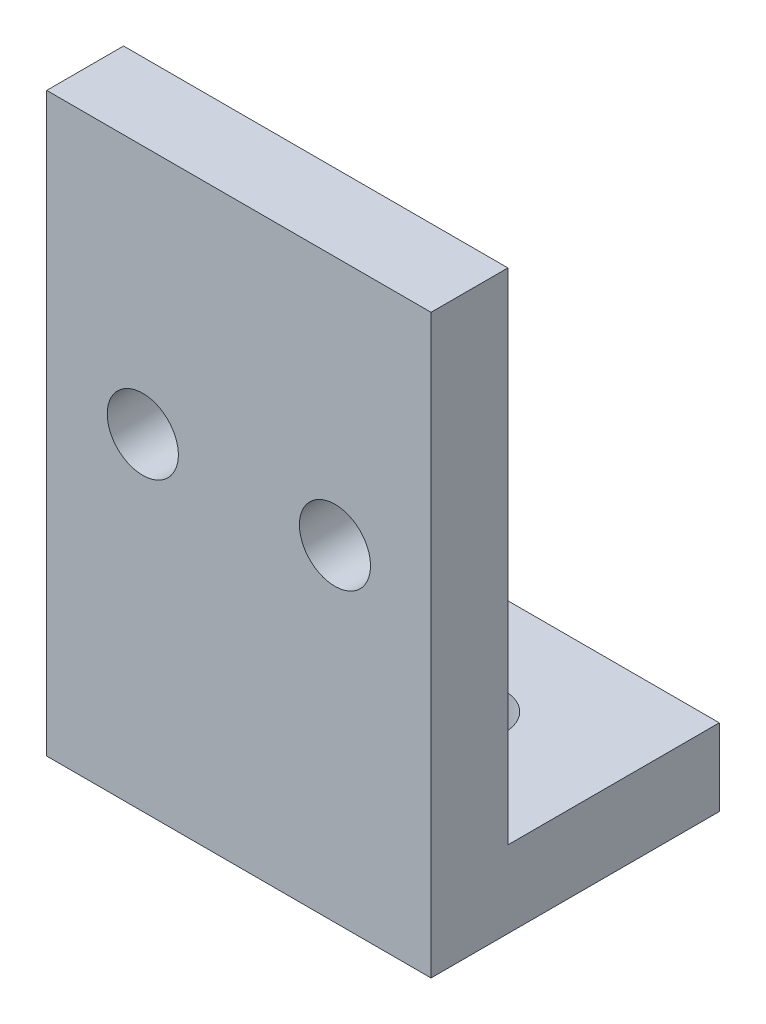
ISO-10303-21;
HEADER;
FILE_DESCRIPTION(('STEP AP214'),'2;1');
FILE_NAME('part.step','',(''),(''),'','','');
FILE_SCHEMA(('AUTOMOTIVE_DESIGN { 1 0 10303 214 1 1 1 1 }'));
ENDSEC;
DATA;
#1=APPLICATION_CONTEXT('core data for automotive mechanical design processes');
#2=APPLICATION_PROTOCOL_DEFINITION('international standard','automotive_design',2000,#1);
#3=PRODUCT_CONTEXT('',#1,'mechanical');
#4=PRODUCT('Part','Part','',(#3));
#5=PRODUCT_RELATED_PRODUCT_CATEGORY('part','',(#4));
#6=PRODUCT_DEFINITION_FORMATION('','',#4);
#7=PRODUCT_DEFINITION_CONTEXT('part definition',#1,'design');
#8=PRODUCT_DEFINITION('design','',#6,#7);
#9=PRODUCT_DEFINITION_SHAPE('','',#8);
#10=(LENGTH_UNIT() NAMED_UNIT(*) SI_UNIT(.MILLI.,.METRE.));
#11=(NAMED_UNIT(*) PLANE_ANGLE_UNIT() SI_UNIT($,.RADIAN.));
#12=(NAMED_UNIT(*) SI_UNIT($,.STERADIAN.) SOLID_ANGLE_UNIT());
#13=UNCERTAINTY_MEASURE_WITH_UNIT(LENGTH_MEASURE(1.E-05),#10,'distance_accuracy_value','');
#14=(GEOMETRIC_REPRESENTATION_CONTEXT(3) GLOBAL_UNCERTAINTY_ASSIGNED_CONTEXT((#13)) GLOBAL_UNIT_ASSIGNED_CONTEXT((#10,
#11,#12)) REPRESENTATION_CONTEXT('',''));
#15=CARTESIAN_POINT('',(0.,0.,0.));
#16=DIRECTION('',(0.,0.,1.));
#17=DIRECTION('',(1.,0.,0.));
#18=AXIS2_PLACEMENT_3D('',#15,#16,#17);
#19=CARTESIAN_POINT('',(10.,-4.,4.));
#20=DIRECTION('',(0.,0.,-1.));
#21=DIRECTION('',(-1.,0.,0.));
#22=AXIS2_PLACEMENT_3D('',#19,#20,#21);
#23=PLANE('',#22);
#24=CARTESIAN_POINT('',(-5.,13.,4.));
#25=DIRECTION('',(0.,0.,-1.));
#26=DIRECTION('',(-1.,0.,0.));
#27=AXIS2_PLACEMENT_3D('',#24,#25,#26);
#28=CIRCLE('',#27,1.85);
#29=CARTESIAN_POINT('',(-6.85,13.,4.));
#30=VERTEX_POINT('',#29);
#31=EDGE_CURVE('E129',#30,#30,#28,.T.);
#32=ORIENTED_EDGE('',*,*,#31,.T.);
#33=EDGE_LOOP('',(#32));
#34=FACE_BOUND('',#33,.T.);
#35=CARTESIAN_POINT('',(5.,13.,4.));
#36=DIRECTION('',(0.,0.,-1.));
#37=DIRECTION('',(-1.,0.,0.));
#38=AXIS2_PLACEMENT_3D('',#35,#36,#37);
#39=CIRCLE('',#38,1.85);
#40=CARTESIAN_POINT('',(3.15,13.,4.));
#41=VERTEX_POINT('',#40);
#42=EDGE_CURVE('E125',#41,#41,#39,.T.);
#43=ORIENTED_EDGE('',*,*,#42,.T.);
#44=EDGE_LOOP('',(#43));
#45=FACE_BOUND('',#44,.T.);
#46=DIRECTION('',(-1.,0.,0.));
#47=VECTOR('',#46,1.);
#48=CARTESIAN_POINT('',(10.,26.,4.));
#49=LINE('',#48,#47);
#50=CARTESIAN_POINT('',(10.,26.,4.));
#51=VERTEX_POINT('',#50);
#52=CARTESIAN_POINT('',(-10.,26.,4.));
#53=VERTEX_POINT('',#52);
#54=EDGE_CURVE('E114',#51,#53,#49,.T.);
#55=ORIENTED_EDGE('',*,*,#54,.T.);
#56=DIRECTION('',(0.,1.,0.));
#57=VECTOR('',#56,1.);
#58=CARTESIAN_POINT('',(-10.,0.,4.));
#59=LINE('',#58,#57);
#60=CARTESIAN_POINT('',(-10.,-4.,4.));
#61=VERTEX_POINT('',#60);
#62=EDGE_CURVE('E113',#61,#53,#59,.T.);
#63=ORIENTED_EDGE('',*,*,#62,.F.);
#64=DIRECTION('',(-1.,0.,0.));
#65=VECTOR('',#64,1.);
#66=CARTESIAN_POINT('',(10.,-4.,4.));
#67=LINE('',#66,#65);
#68=CARTESIAN_POINT('',(10.,-4.,4.));
#69=VERTEX_POINT('',#68);
#70=EDGE_CURVE('E99',#69,#61,#67,.T.);
#71=ORIENTED_EDGE('',*,*,#70,.F.);
#72=DIRECTION('',(0.,-1.,0.));
#73=VECTOR('',#72,1.);
#74=CARTESIAN_POINT('',(10.,-4.,4.));
#75=LINE('',#74,#73);
#76=EDGE_CURVE('E145',#51,#69,#75,.T.);
#77=ORIENTED_EDGE('',*,*,#76,.F.);
#78=EDGE_LOOP('',(#55,#63,#71,#77));
#79=FACE_BOUND('',#78,.T.);
#80=ADVANCED_FACE('F41',(#34,#45,#79),#23,.F.);
#81=CARTESIAN_POINT('',(10.,-4.,-11.));
#82=DIRECTION('',(0.,1.,0.));
#83=DIRECTION('',(0.,0.,1.));
#84=AXIS2_PLACEMENT_3D('',#81,#82,#83);
#85=PLANE('',#84);
#86=CARTESIAN_POINT('',(3.00000000000001,-4.,-4.99999999999997));
#87=DIRECTION('',(0.,1.,0.));
#88=DIRECTION('',(0.,0.,1.));
#89=AXIS2_PLACEMENT_3D('',#86,#87,#88);
#90=CIRCLE('',#89,1.85);
#91=CARTESIAN_POINT('',(3.00000000000001,-4.,-3.14999999999996));
#92=VERTEX_POINT('',#91);
#93=EDGE_CURVE('E141',#92,#92,#90,.T.);
#94=ORIENTED_EDGE('',*,*,#93,.T.);
#95=EDGE_LOOP('',(#94));
#96=FACE_BOUND('',#95,.T.);
#97=ORIENTED_EDGE('',*,*,#70,.T.);
#98=DIRECTION('',(0.,0.,1.));
#99=VECTOR('',#98,1.);
#100=CARTESIAN_POINT('',(-10.,-4.,0.));
#101=LINE('',#100,#99);
#102=CARTESIAN_POINT('',(-10.,-4.,-11.));
#103=VERTEX_POINT('',#102);
#104=EDGE_CURVE('E104',#103,#61,#101,.T.);
#105=ORIENTED_EDGE('',*,*,#104,.F.);
#106=DIRECTION('',(-1.,0.,0.));
#107=VECTOR('',#106,1.);
#108=CARTESIAN_POINT('',(10.,-4.,-11.));
#109=LINE('',#108,#107);
#110=CARTESIAN_POINT('',(10.,-4.,-11.));
#111=VERTEX_POINT('',#110);
#112=EDGE_CURVE('E110',#111,#103,#109,.T.);
#113=ORIENTED_EDGE('',*,*,#112,.F.);
#114=DIRECTION('',(0.,0.,-1.));
#115=VECTOR('',#114,1.);
#116=CARTESIAN_POINT('',(10.,-4.,-11.));
#117=LINE('',#116,#115);
#118=EDGE_CURVE('E105',#69,#111,#117,.T.);
#119=ORIENTED_EDGE('',*,*,#118,.F.);
#120=EDGE_LOOP('',(#97,#105,#113,#119));
#121=FACE_BOUND('',#120,.T.);
#122=ADVANCED_FACE('F101',(#96,#121),#85,.F.);
#123=CARTESIAN_POINT('',(10.,0.,-11.));
#124=DIRECTION('',(0.,0.,1.));
#125=DIRECTION('',(1.,0.,0.));
#126=AXIS2_PLACEMENT_3D('',#123,#124,#125);
#127=PLANE('',#126);
#128=ORIENTED_EDGE('',*,*,#112,.T.);
#129=DIRECTION('',(0.,-1.,0.));
#130=VECTOR('',#129,1.);
#131=CARTESIAN_POINT('',(-10.,0.,-11.));
#132=LINE('',#131,#130);
#133=CARTESIAN_POINT('',(-10.,0.,-11.));
#134=VERTEX_POINT('',#133);
#135=EDGE_CURVE('E124',#134,#103,#132,.T.);
#136=ORIENTED_EDGE('',*,*,#135,.F.);
#137=DIRECTION('',(-1.,0.,0.));
#138=VECTOR('',#137,1.);
#139=CARTESIAN_POINT('',(10.,0.,-11.));
#140=LINE('',#139,#138);
#141=CARTESIAN_POINT('',(10.,0.,-11.));
#142=VERTEX_POINT('',#141);
#143=EDGE_CURVE('E170',#142,#134,#140,.T.);
#144=ORIENTED_EDGE('',*,*,#143,.F.);
#145=DIRECTION('',(0.,1.,0.));
#146=VECTOR('',#145,1.);
#147=CARTESIAN_POINT('',(10.,0.,-11.));
#148=LINE('',#147,#146);
#149=EDGE_CURVE('E153',#111,#142,#148,.T.);
#150=ORIENTED_EDGE('',*,*,#149,.F.);
#151=EDGE_LOOP('',(#128,#136,#144,#150));
#152=FACE_BOUND('',#151,.T.);
#153=ADVANCED_FACE('F231',(#152),#127,.F.);
#154=CARTESIAN_POINT('',(10.,0.,0.));
#155=DIRECTION('',(0.,-1.,0.));
#156=DIRECTION('',(0.,0.,-1.));
#157=AXIS2_PLACEMENT_3D('',#154,#155,#156);
#158=PLANE('',#157);
#159=CARTESIAN_POINT('',(3.00000000000001,0.,-4.99999999999997));
#160=DIRECTION('',(0.,1.,0.));
#161=DIRECTION('',(0.,0.,1.));
#162=AXIS2_PLACEMENT_3D('',#159,#160,#161);
#163=CIRCLE('',#162,1.85);
#164=CARTESIAN_POINT('',(3.00000000000001,0.,-3.14999999999996));
#165=VERTEX_POINT('',#164);
#166=EDGE_CURVE('E140',#165,#165,#163,.T.);
#167=ORIENTED_EDGE('',*,*,#166,.F.);
#168=EDGE_LOOP('',(#167));
#169=FACE_BOUND('',#168,.T.);
#170=ORIENTED_EDGE('',*,*,#143,.T.);
#171=DIRECTION('',(0.,0.,-1.));
#172=VECTOR('',#171,1.);
#173=CARTESIAN_POINT('',(-10.,0.,0.));
#174=LINE('',#173,#172);
#175=CARTESIAN_POINT('',(-10.,0.,0.));
#176=VERTEX_POINT('',#175);
#177=EDGE_CURVE('E137',#176,#134,#174,.T.);
#178=ORIENTED_EDGE('',*,*,#177,.F.);
#179=DIRECTION('',(-1.,0.,0.));
#180=VECTOR('',#179,1.);
#181=CARTESIAN_POINT('',(10.,0.,0.));
#182=LINE('',#181,#180);
#183=CARTESIAN_POINT('',(10.,0.,0.));
#184=VERTEX_POINT('',#183);
#185=EDGE_CURVE('E167',#184,#176,#182,.T.);
#186=ORIENTED_EDGE('',*,*,#185,.F.);
#187=DIRECTION('',(0.,0.,1.));
#188=VECTOR('',#187,1.);
#189=CARTESIAN_POINT('',(10.,0.,0.));
#190=LINE('',#189,#188);
#191=EDGE_CURVE('E156',#142,#184,#190,.T.);
#192=ORIENTED_EDGE('',*,*,#191,.F.);
#193=EDGE_LOOP('',(#170,#178,#186,#192));
#194=FACE_BOUND('',#193,.T.);
#195=ADVANCED_FACE('F228',(#169,#194),#158,.F.);
#196=CARTESIAN_POINT('',(10.,26.,0.));
#197=DIRECTION('',(0.,0.,1.));
#198=DIRECTION('',(1.,0.,0.));
#199=AXIS2_PLACEMENT_3D('',#196,#197,#198);
#200=PLANE('',#199);
#201=CARTESIAN_POINT('',(-5.,13.,0.));
#202=DIRECTION('',(0.,0.,1.));
#203=DIRECTION('',(1.,0.,0.));
#204=AXIS2_PLACEMENT_3D('',#201,#202,#203);
#205=CIRCLE('',#204,2.85000000000001);
#206=CARTESIAN_POINT('',(-2.14999999999999,13.,0.));
#207=VERTEX_POINT('',#206);
#208=EDGE_CURVE('E50',#207,#207,#205,.T.);
#209=ORIENTED_EDGE('',*,*,#208,.T.);
#210=EDGE_LOOP('',(#209));
#211=FACE_BOUND('',#210,.T.);
#212=CARTESIAN_POINT('',(5.,13.,0.));
#213=DIRECTION('',(0.,0.,1.));
#214=DIRECTION('',(1.,0.,0.));
#215=AXIS2_PLACEMENT_3D('',#212,#213,#214);
#216=CIRCLE('',#215,2.85000000000001);
#217=CARTESIAN_POINT('',(7.85000000000001,13.,0.));
#218=VERTEX_POINT('',#217);
#219=EDGE_CURVE('E178',#218,#218,#216,.T.);
#220=ORIENTED_EDGE('',*,*,#219,.T.);
#221=EDGE_LOOP('',(#220));
#222=FACE_BOUND('',#221,.T.);
#223=ORIENTED_EDGE('',*,*,#185,.T.);
#224=DIRECTION('',(0.,-1.,0.));
#225=VECTOR('',#224,1.);
#226=CARTESIAN_POINT('',(-10.,0.,0.));
#227=LINE('',#226,#225);
#228=CARTESIAN_POINT('',(-10.,26.,0.));
#229=VERTEX_POINT('',#228);
#230=EDGE_CURVE('E134',#229,#176,#227,.T.);
#231=ORIENTED_EDGE('',*,*,#230,.F.);
#232=DIRECTION('',(-1.,0.,0.));
#233=VECTOR('',#232,1.);
#234=CARTESIAN_POINT('',(10.,26.,0.));
#235=LINE('',#234,#233);
#236=CARTESIAN_POINT('',(10.,26.,0.));
#237=VERTEX_POINT('',#236);
#238=EDGE_CURVE('E164',#237,#229,#235,.T.);
#239=ORIENTED_EDGE('',*,*,#238,.F.);
#240=DIRECTION('',(0.,1.,0.));
#241=VECTOR('',#240,1.);
#242=CARTESIAN_POINT('',(10.,26.,0.));
#243=LINE('',#242,#241);
#244=EDGE_CURVE('E62',#184,#237,#243,.T.);
#245=ORIENTED_EDGE('',*,*,#244,.F.);
#246=EDGE_LOOP('',(#223,#231,#239,#245));
#247=FACE_BOUND('',#246,.T.);
#248=ADVANCED_FACE('F185',(#211,#222,#247),#200,.F.);
#249=CARTESIAN_POINT('',(10.,26.,4.));
#250=DIRECTION('',(0.,-1.,0.));
#251=DIRECTION('',(0.,0.,-1.));
#252=AXIS2_PLACEMENT_3D('',#249,#250,#251);
#253=PLANE('',#252);
#254=ORIENTED_EDGE('',*,*,#238,.T.);
#255=DIRECTION('',(0.,0.,-1.));
#256=VECTOR('',#255,1.);
#257=CARTESIAN_POINT('',(-10.,26.,0.));
#258=LINE('',#257,#256);
#259=EDGE_CURVE('E118',#53,#229,#258,.T.);
#260=ORIENTED_EDGE('',*,*,#259,.F.);
#261=ORIENTED_EDGE('',*,*,#54,.F.);
#262=DIRECTION('',(0.,0.,1.));
#263=VECTOR('',#262,1.);
#264=CARTESIAN_POINT('',(10.,26.,4.));
#265=LINE('',#264,#263);
#266=EDGE_CURVE('E57',#237,#51,#265,.T.);
#267=ORIENTED_EDGE('',*,*,#266,.F.);
#268=EDGE_LOOP('',(#254,#260,#261,#267));
#269=FACE_BOUND('',#268,.T.);
#270=ADVANCED_FACE('F222',(#269),#253,.F.);
#271=CARTESIAN_POINT('',(10.,0.,0.));
#272=DIRECTION('',(-1.,0.,0.));
#273=DIRECTION('',(0.,0.,1.));
#274=AXIS2_PLACEMENT_3D('',#271,#272,#273);
#275=PLANE('',#274);
#276=ORIENTED_EDGE('',*,*,#76,.T.);
#277=ORIENTED_EDGE('',*,*,#118,.T.);
#278=ORIENTED_EDGE('',*,*,#149,.T.);
#279=ORIENTED_EDGE('',*,*,#191,.T.);
#280=ORIENTED_EDGE('',*,*,#244,.T.);
#281=ORIENTED_EDGE('',*,*,#266,.T.);
#282=EDGE_LOOP('',(#276,#277,#278,#279,#280,#281));
#283=FACE_BOUND('',#282,.T.);
#284=ADVANCED_FACE('F218',(#283),#275,.F.);
#285=CARTESIAN_POINT('',(3.00000000000001,-4.,-4.99999999999997));
#286=DIRECTION('',(0.,1.,0.));
#287=DIRECTION('',(0.,0.,1.));
#288=AXIS2_PLACEMENT_3D('',#285,#286,#287);
#289=CYLINDRICAL_SURFACE('',#288,1.85);
#290=ORIENTED_EDGE('',*,*,#93,.F.);
#291=EDGE_LOOP('',(#290));
#292=FACE_BOUND('',#291,.T.);
#293=ORIENTED_EDGE('',*,*,#166,.T.);
#294=EDGE_LOOP('',(#293));
#295=FACE_BOUND('',#294,.T.);
#296=ADVANCED_FACE('F213',(#292,#295),#289,.F.);
#297=CARTESIAN_POINT('',(-10.,0.,0.));
#298=DIRECTION('',(-1.,0.,0.));
#299=DIRECTION('',(0.,0.,1.));
#300=AXIS2_PLACEMENT_3D('',#297,#298,#299);
#301=PLANE('',#300);
#302=ORIENTED_EDGE('',*,*,#104,.T.);
#303=ORIENTED_EDGE('',*,*,#62,.T.);
#304=ORIENTED_EDGE('',*,*,#259,.T.);
#305=ORIENTED_EDGE('',*,*,#230,.T.);
#306=ORIENTED_EDGE('',*,*,#177,.T.);
#307=ORIENTED_EDGE('',*,*,#135,.T.);
#308=EDGE_LOOP('',(#302,#303,#304,#305,#306,#307));
#309=FACE_BOUND('',#308,.T.);
#310=ADVANCED_FACE('F121',(#309),#301,.T.);
#311=CARTESIAN_POINT('',(5.,13.,4.));
#312=DIRECTION('',(0.,0.,-1.));
#313=DIRECTION('',(-1.,0.,0.));
#314=AXIS2_PLACEMENT_3D('',#311,#312,#313);
#315=CYLINDRICAL_SURFACE('',#314,1.85);
#316=CARTESIAN_POINT('',(5.,13.,1.));
#317=DIRECTION('',(0.,0.,1.));
#318=DIRECTION('',(1.,0.,0.));
#319=AXIS2_PLACEMENT_3D('',#316,#317,#318);
#320=CIRCLE('',#319,1.85);
#321=CARTESIAN_POINT('',(6.85,13.,1.));
#322=VERTEX_POINT('',#321);
#323=EDGE_CURVE('E11',#322,#322,#320,.F.);
#324=ORIENTED_EDGE('',*,*,#323,.T.);
#325=EDGE_LOOP('',(#324));
#326=FACE_BOUND('',#325,.T.);
#327=ORIENTED_EDGE('',*,*,#42,.F.);
#328=EDGE_LOOP('',(#327));
#329=FACE_BOUND('',#328,.T.);
#330=ADVANCED_FACE('F196',(#326,#329),#315,.F.);
#331=CARTESIAN_POINT('',(-5.,13.,4.));
#332=DIRECTION('',(0.,0.,-1.));
#333=DIRECTION('',(-1.,0.,0.));
#334=AXIS2_PLACEMENT_3D('',#331,#332,#333);
#335=CYLINDRICAL_SURFACE('',#334,1.85);
#336=CARTESIAN_POINT('',(-5.,13.,1.));
#337=DIRECTION('',(0.,0.,1.));
#338=DIRECTION('',(1.,0.,0.));
#339=AXIS2_PLACEMENT_3D('',#336,#337,#338);
#340=CIRCLE('',#339,1.85);
#341=CARTESIAN_POINT('',(-3.15,13.,1.));
#342=VERTEX_POINT('',#341);
#343=EDGE_CURVE('E109',#342,#342,#340,.F.);
#344=ORIENTED_EDGE('',*,*,#343,.T.);
#345=EDGE_LOOP('',(#344));
#346=FACE_BOUND('',#345,.T.);
#347=ORIENTED_EDGE('',*,*,#31,.F.);
#348=EDGE_LOOP('',(#347));
#349=FACE_BOUND('',#348,.T.);
#350=ADVANCED_FACE('F191',(#346,#349),#335,.F.);
#351=CARTESIAN_POINT('',(-5.,13.,1.));
#352=DIRECTION('',(0.,0.,-1.));
#353=DIRECTION('',(-1.,0.,0.));
#354=AXIS2_PLACEMENT_3D('',#351,#352,#353);
#355=CONICAL_SURFACE('',#354,1.85,0.78539816339745);
#356=ORIENTED_EDGE('',*,*,#208,.F.);
#357=EDGE_LOOP('',(#356));
#358=FACE_BOUND('',#357,.T.);
#359=ORIENTED_EDGE('',*,*,#343,.F.);
#360=EDGE_LOOP('',(#359));
#361=FACE_BOUND('',#360,.T.);
#362=ADVANCED_FACE('F188',(#358,#361),#355,.F.);
#363=CARTESIAN_POINT('',(5.,13.,1.));
#364=DIRECTION('',(0.,0.,-1.));
#365=DIRECTION('',(-1.,0.,0.));
#366=AXIS2_PLACEMENT_3D('',#363,#364,#365);
#367=CONICAL_SURFACE('',#366,1.85,0.78539816339745);
#368=ORIENTED_EDGE('',*,*,#219,.F.);
#369=EDGE_LOOP('',(#368));
#370=FACE_BOUND('',#369,.T.);
#371=ORIENTED_EDGE('',*,*,#323,.F.);
#372=EDGE_LOOP('',(#371));
#373=FACE_BOUND('',#372,.T.);
#374=ADVANCED_FACE('F43',(#370,#373),#367,.F.);
#375=CLOSED_SHELL('',(#80,#122,#153,#195,#248,#270,#284,#296,#310,#330,#350,#362,#374));
#376=MANIFOLD_SOLID_BREP('B2',#375);
#377=ADVANCED_BREP_SHAPE_REPRESENTATION('',(#18,#376),#14);
#378=SHAPE_DEFINITION_REPRESENTATION(#9,#377);
ENDSEC;
END-ISO-10303-21;
